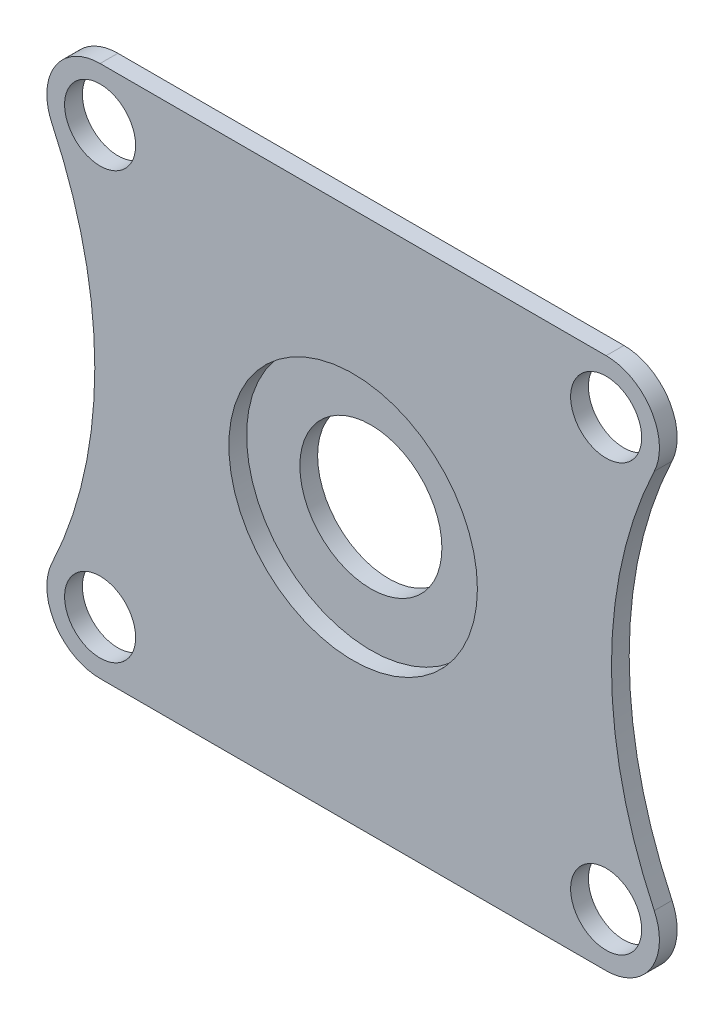
ISO-10303-21;
HEADER;
FILE_DESCRIPTION(('STEP AP214'),'2;1');
FILE_NAME('part.step','',(''),(''),'','','');
FILE_SCHEMA(('AUTOMOTIVE_DESIGN { 1 0 10303 214 1 1 1 1 }'));
ENDSEC;
DATA;
#1=APPLICATION_CONTEXT('core data for automotive mechanical design processes');
#2=APPLICATION_PROTOCOL_DEFINITION('international standard','automotive_design',2000,#1);
#3=PRODUCT_CONTEXT('',#1,'mechanical');
#4=PRODUCT('Part','Part','',(#3));
#5=PRODUCT_RELATED_PRODUCT_CATEGORY('part','',(#4));
#6=PRODUCT_DEFINITION_FORMATION('','',#4);
#7=PRODUCT_DEFINITION_CONTEXT('part definition',#1,'design');
#8=PRODUCT_DEFINITION('design','',#6,#7);
#9=PRODUCT_DEFINITION_SHAPE('','',#8);
#10=(LENGTH_UNIT() NAMED_UNIT(*) SI_UNIT(.MILLI.,.METRE.));
#11=(NAMED_UNIT(*) PLANE_ANGLE_UNIT() SI_UNIT($,.RADIAN.));
#12=(NAMED_UNIT(*) SI_UNIT($,.STERADIAN.) SOLID_ANGLE_UNIT());
#13=UNCERTAINTY_MEASURE_WITH_UNIT(LENGTH_MEASURE(1.E-05),#10,'distance_accuracy_value','');
#14=(GEOMETRIC_REPRESENTATION_CONTEXT(3) GLOBAL_UNCERTAINTY_ASSIGNED_CONTEXT((#13)) GLOBAL_UNIT_ASSIGNED_CONTEXT((#10,
#11,#12)) REPRESENTATION_CONTEXT('',''));
#15=CARTESIAN_POINT('',(0.,0.,0.));
#16=DIRECTION('',(0.,0.,1.));
#17=DIRECTION('',(1.,0.,0.));
#18=AXIS2_PLACEMENT_3D('',#15,#16,#17);
#19=CARTESIAN_POINT('',(0.,0.,9.));
#20=DIRECTION('',(0.,0.,-1.));
#21=DIRECTION('',(-1.,0.,0.));
#22=AXIS2_PLACEMENT_3D('',#19,#20,#21);
#23=CYLINDRICAL_SURFACE('',#22,4.);
#24=CARTESIAN_POINT('',(0.,0.,-1.));
#25=DIRECTION('',(0.,0.,-1.));
#26=DIRECTION('',(-1.,0.,0.));
#27=AXIS2_PLACEMENT_3D('',#24,#25,#26);
#28=CIRCLE('',#27,4.);
#29=CARTESIAN_POINT('',(-4.,0.,-0.999999999999999));
#30=VERTEX_POINT('',#29);
#31=EDGE_CURVE('E332',#30,#30,#28,.T.);
#32=ORIENTED_EDGE('',*,*,#31,.T.);
#33=EDGE_LOOP('',(#32));
#34=FACE_BOUND('',#33,.T.);
#35=CARTESIAN_POINT('',(0.,0.,0.));
#36=DIRECTION('',(0.,0.,1.));
#37=DIRECTION('',(1.,0.,0.));
#38=AXIS2_PLACEMENT_3D('',#35,#36,#37);
#39=CIRCLE('',#38,4.);
#40=CARTESIAN_POINT('',(4.,0.,0.));
#41=VERTEX_POINT('',#40);
#42=EDGE_CURVE('E42',#41,#41,#39,.F.);
#43=ORIENTED_EDGE('',*,*,#42,.F.);
#44=EDGE_LOOP('',(#43));
#45=FACE_BOUND('',#44,.T.);
#46=ADVANCED_FACE('F38',(#34,#45),#23,.F.);
#47=CARTESIAN_POINT('',(39.548221281347,0.,1.));
#48=DIRECTION('',(0.,0.,1.));
#49=DIRECTION('',(1.,0.,0.));
#50=AXIS2_PLACEMENT_3D('',#47,#48,#49);
#51=PLANE('',#50);
#52=CARTESIAN_POINT('',(0.,0.,1.));
#53=DIRECTION('',(0.,0.,1.));
#54=DIRECTION('',(1.,0.,0.));
#55=AXIS2_PLACEMENT_3D('',#52,#53,#54);
#56=CIRCLE('',#55,7.);
#57=CARTESIAN_POINT('',(7.,0.,1.));
#58=VERTEX_POINT('',#57);
#59=EDGE_CURVE('E338',#58,#58,#56,.T.);
#60=ORIENTED_EDGE('',*,*,#59,.F.);
#61=EDGE_LOOP('',(#60));
#62=FACE_BOUND('',#61,.T.);
#63=CARTESIAN_POINT('',(-14.25,-12.,1.));
#64=DIRECTION('',(0.,0.,1.));
#65=DIRECTION('',(1.,0.,0.));
#66=AXIS2_PLACEMENT_3D('',#63,#64,#65);
#67=CIRCLE('',#66,2.);
#68=CARTESIAN_POINT('',(-12.25,-12.,1.));
#69=VERTEX_POINT('',#68);
#70=EDGE_CURVE('E316',#69,#69,#67,.T.);
#71=ORIENTED_EDGE('',*,*,#70,.F.);
#72=EDGE_LOOP('',(#71));
#73=FACE_BOUND('',#72,.T.);
#74=CARTESIAN_POINT('',(14.25,12.,1.));
#75=DIRECTION('',(0.,0.,1.));
#76=DIRECTION('',(1.,0.,0.));
#77=AXIS2_PLACEMENT_3D('',#74,#75,#76);
#78=CIRCLE('',#77,2.);
#79=CARTESIAN_POINT('',(16.25,12.,1.));
#80=VERTEX_POINT('',#79);
#81=EDGE_CURVE('E148',#80,#80,#78,.T.);
#82=ORIENTED_EDGE('',*,*,#81,.F.);
#83=EDGE_LOOP('',(#82));
#84=FACE_BOUND('',#83,.T.);
#85=CARTESIAN_POINT('',(39.548221281347,0.,1.));
#86=DIRECTION('',(0.,0.,-1.));
#87=DIRECTION('',(1.,0.,0.));
#88=AXIS2_PLACEMENT_3D('',#85,#86,#87);
#89=CIRCLE('',#88,25.);
#90=CARTESIAN_POINT('',(16.9605237087158,-10.7142857142857,1.));
#91=VERTEX_POINT('',#90);
#92=CARTESIAN_POINT('',(16.9605237087158,10.7142857142857,1.));
#93=VERTEX_POINT('',#92);
#94=EDGE_CURVE('E166',#91,#93,#89,.T.);
#95=ORIENTED_EDGE('',*,*,#94,.T.);
#96=CARTESIAN_POINT('',(14.25,12.,1.));
#97=DIRECTION('',(0.,0.,1.));
#98=DIRECTION('',(1.,0.,0.));
#99=AXIS2_PLACEMENT_3D('',#96,#97,#98);
#100=CIRCLE('',#99,3.);
#101=CARTESIAN_POINT('',(14.25,15.,1.));
#102=VERTEX_POINT('',#101);
#103=EDGE_CURVE('E101',#93,#102,#100,.T.);
#104=ORIENTED_EDGE('',*,*,#103,.T.);
#105=DIRECTION('',(-1.,0.,0.));
#106=VECTOR('',#105,1.);
#107=CARTESIAN_POINT('',(-14.25,15.,1.));
#108=LINE('',#107,#106);
#109=CARTESIAN_POINT('',(-14.25,15.,1.));
#110=VERTEX_POINT('',#109);
#111=EDGE_CURVE('E291',#102,#110,#108,.T.);
#112=ORIENTED_EDGE('',*,*,#111,.T.);
#113=CARTESIAN_POINT('',(-14.25,12.,1.));
#114=DIRECTION('',(0.,0.,1.));
#115=DIRECTION('',(1.,0.,0.));
#116=AXIS2_PLACEMENT_3D('',#113,#114,#115);
#117=CIRCLE('',#116,3.);
#118=CARTESIAN_POINT('',(-16.9605237087158,10.7142857142857,1.));
#119=VERTEX_POINT('',#118);
#120=EDGE_CURVE('E294',#110,#119,#117,.T.);
#121=ORIENTED_EDGE('',*,*,#120,.T.);
#122=CARTESIAN_POINT('',(-39.548221281347,0.,1.));
#123=DIRECTION('',(0.,0.,-1.));
#124=DIRECTION('',(1.,0.,0.));
#125=AXIS2_PLACEMENT_3D('',#122,#123,#124);
#126=CIRCLE('',#125,25.);
#127=CARTESIAN_POINT('',(-16.9605237087158,-10.7142857142857,1.));
#128=VERTEX_POINT('',#127);
#129=EDGE_CURVE('E121',#119,#128,#126,.T.);
#130=ORIENTED_EDGE('',*,*,#129,.T.);
#131=CARTESIAN_POINT('',(-14.25,-12.,1.));
#132=DIRECTION('',(0.,0.,1.));
#133=DIRECTION('',(1.,0.,0.));
#134=AXIS2_PLACEMENT_3D('',#131,#132,#133);
#135=CIRCLE('',#134,3.);
#136=CARTESIAN_POINT('',(-14.25,-15.,1.));
#137=VERTEX_POINT('',#136);
#138=EDGE_CURVE('E114',#128,#137,#135,.T.);
#139=ORIENTED_EDGE('',*,*,#138,.T.);
#140=DIRECTION('',(1.,0.,0.));
#141=VECTOR('',#140,1.);
#142=CARTESIAN_POINT('',(-14.25,-15.,1.));
#143=LINE('',#142,#141);
#144=CARTESIAN_POINT('',(14.25,-15.,1.));
#145=VERTEX_POINT('',#144);
#146=EDGE_CURVE('E119',#137,#145,#143,.T.);
#147=ORIENTED_EDGE('',*,*,#146,.T.);
#148=CARTESIAN_POINT('',(14.25,-12.,1.));
#149=DIRECTION('',(0.,0.,1.));
#150=DIRECTION('',(1.,0.,0.));
#151=AXIS2_PLACEMENT_3D('',#148,#149,#150);
#152=CIRCLE('',#151,3.);
#153=EDGE_CURVE('E57',#145,#91,#152,.T.);
#154=ORIENTED_EDGE('',*,*,#153,.T.);
#155=EDGE_LOOP('',(#95,#104,#112,#121,#130,#139,#147,#154));
#156=FACE_BOUND('',#155,.T.);
#157=CARTESIAN_POINT('',(-14.25,12.,1.));
#158=DIRECTION('',(0.,0.,1.));
#159=DIRECTION('',(1.,0.,0.));
#160=AXIS2_PLACEMENT_3D('',#157,#158,#159);
#161=CIRCLE('',#160,2.);
#162=CARTESIAN_POINT('',(-12.25,12.,1.));
#163=VERTEX_POINT('',#162);
#164=EDGE_CURVE('E308',#163,#163,#161,.T.);
#165=ORIENTED_EDGE('',*,*,#164,.F.);
#166=EDGE_LOOP('',(#165));
#167=FACE_BOUND('',#166,.T.);
#168=CARTESIAN_POINT('',(14.25,-12.,1.));
#169=DIRECTION('',(0.,0.,1.));
#170=DIRECTION('',(1.,0.,0.));
#171=AXIS2_PLACEMENT_3D('',#168,#169,#170);
#172=CIRCLE('',#171,2.);
#173=CARTESIAN_POINT('',(16.25,-12.,1.));
#174=VERTEX_POINT('',#173);
#175=EDGE_CURVE('E324',#174,#174,#172,.T.);
#176=ORIENTED_EDGE('',*,*,#175,.F.);
#177=EDGE_LOOP('',(#176));
#178=FACE_BOUND('',#177,.T.);
#179=ADVANCED_FACE('F116',(#62,#73,#84,#156,#167,#178),#51,.T.);
#180=CARTESIAN_POINT('',(39.548221281347,0.,0.));
#181=DIRECTION('',(0.,0.,1.));
#182=DIRECTION('',(1.,0.,0.));
#183=AXIS2_PLACEMENT_3D('',#180,#181,#182);
#184=PLANE('',#183);
#185=CARTESIAN_POINT('',(0.,0.,0.));
#186=DIRECTION('',(0.,0.,1.));
#187=DIRECTION('',(1.,0.,0.));
#188=AXIS2_PLACEMENT_3D('',#185,#186,#187);
#189=CIRCLE('',#188,13.2310562561766);
#190=CARTESIAN_POINT('',(13.2310562561766,0.,0.));
#191=VERTEX_POINT('',#190);
#192=EDGE_CURVE('E192',#191,#191,#189,.T.);
#193=ORIENTED_EDGE('',*,*,#192,.T.);
#194=EDGE_LOOP('',(#193));
#195=FACE_BOUND('',#194,.T.);
#196=CARTESIAN_POINT('',(39.548221281347,0.,0.));
#197=DIRECTION('',(0.,0.,-1.));
#198=DIRECTION('',(1.,0.,0.));
#199=AXIS2_PLACEMENT_3D('',#196,#197,#198);
#200=CIRCLE('',#199,25.);
#201=CARTESIAN_POINT('',(16.9605237087158,-10.7142857142857,0.));
#202=VERTEX_POINT('',#201);
#203=CARTESIAN_POINT('',(16.9605237087158,10.7142857142857,0.));
#204=VERTEX_POINT('',#203);
#205=EDGE_CURVE('E143',#202,#204,#200,.T.);
#206=ORIENTED_EDGE('',*,*,#205,.F.);
#207=CARTESIAN_POINT('',(14.25,-12.,0.));
#208=DIRECTION('',(0.,0.,1.));
#209=DIRECTION('',(1.,0.,0.));
#210=AXIS2_PLACEMENT_3D('',#207,#208,#209);
#211=CIRCLE('',#210,3.);
#212=CARTESIAN_POINT('',(14.25,-15.,0.));
#213=VERTEX_POINT('',#212);
#214=EDGE_CURVE('E92',#213,#202,#211,.T.);
#215=ORIENTED_EDGE('',*,*,#214,.F.);
#216=DIRECTION('',(1.,0.,0.));
#217=VECTOR('',#216,1.);
#218=CARTESIAN_POINT('',(-14.25,-15.,0.));
#219=LINE('',#218,#217);
#220=CARTESIAN_POINT('',(-14.25,-15.,0.));
#221=VERTEX_POINT('',#220);
#222=EDGE_CURVE('E86',#221,#213,#219,.T.);
#223=ORIENTED_EDGE('',*,*,#222,.F.);
#224=CARTESIAN_POINT('',(-14.25,-12.,0.));
#225=DIRECTION('',(0.,0.,1.));
#226=DIRECTION('',(1.,0.,0.));
#227=AXIS2_PLACEMENT_3D('',#224,#225,#226);
#228=CIRCLE('',#227,3.);
#229=CARTESIAN_POINT('',(-16.9605237087158,-10.7142857142857,0.));
#230=VERTEX_POINT('',#229);
#231=EDGE_CURVE('E130',#230,#221,#228,.T.);
#232=ORIENTED_EDGE('',*,*,#231,.F.);
#233=CARTESIAN_POINT('',(-39.548221281347,0.,0.));
#234=DIRECTION('',(0.,0.,-1.));
#235=DIRECTION('',(1.,0.,0.));
#236=AXIS2_PLACEMENT_3D('',#233,#234,#235);
#237=CIRCLE('',#236,25.);
#238=CARTESIAN_POINT('',(-16.9605237087158,10.7142857142857,0.));
#239=VERTEX_POINT('',#238);
#240=EDGE_CURVE('E157',#239,#230,#237,.T.);
#241=ORIENTED_EDGE('',*,*,#240,.F.);
#242=CARTESIAN_POINT('',(-14.25,12.,0.));
#243=DIRECTION('',(0.,0.,1.));
#244=DIRECTION('',(1.,0.,0.));
#245=AXIS2_PLACEMENT_3D('',#242,#243,#244);
#246=CIRCLE('',#245,3.);
#247=CARTESIAN_POINT('',(-14.25,15.,0.));
#248=VERTEX_POINT('',#247);
#249=EDGE_CURVE('E154',#248,#239,#246,.T.);
#250=ORIENTED_EDGE('',*,*,#249,.F.);
#251=DIRECTION('',(-1.,0.,0.));
#252=VECTOR('',#251,1.);
#253=CARTESIAN_POINT('',(-14.25,15.,0.));
#254=LINE('',#253,#252);
#255=CARTESIAN_POINT('',(14.25,15.,0.));
#256=VERTEX_POINT('',#255);
#257=EDGE_CURVE('E151',#256,#248,#254,.T.);
#258=ORIENTED_EDGE('',*,*,#257,.F.);
#259=CARTESIAN_POINT('',(14.25,12.,0.));
#260=DIRECTION('',(0.,0.,1.));
#261=DIRECTION('',(1.,0.,0.));
#262=AXIS2_PLACEMENT_3D('',#259,#260,#261);
#263=CIRCLE('',#262,3.);
#264=EDGE_CURVE('E147',#204,#256,#263,.T.);
#265=ORIENTED_EDGE('',*,*,#264,.F.);
#266=EDGE_LOOP('',(#206,#215,#223,#232,#241,#250,#258,#265));
#267=FACE_BOUND('',#266,.T.);
#268=CARTESIAN_POINT('',(14.25,12.,0.));
#269=DIRECTION('',(0.,0.,1.));
#270=DIRECTION('',(1.,0.,0.));
#271=AXIS2_PLACEMENT_3D('',#268,#269,#270);
#272=CIRCLE('',#271,2.);
#273=CARTESIAN_POINT('',(16.25,12.,0.));
#274=VERTEX_POINT('',#273);
#275=EDGE_CURVE('E304',#274,#274,#272,.T.);
#276=ORIENTED_EDGE('',*,*,#275,.T.);
#277=EDGE_LOOP('',(#276));
#278=FACE_BOUND('',#277,.T.);
#279=CARTESIAN_POINT('',(-14.25,12.,0.));
#280=DIRECTION('',(0.,0.,1.));
#281=DIRECTION('',(1.,0.,0.));
#282=AXIS2_PLACEMENT_3D('',#279,#280,#281);
#283=CIRCLE('',#282,2.);
#284=CARTESIAN_POINT('',(-12.25,12.,0.));
#285=VERTEX_POINT('',#284);
#286=EDGE_CURVE('E312',#285,#285,#283,.T.);
#287=ORIENTED_EDGE('',*,*,#286,.T.);
#288=EDGE_LOOP('',(#287));
#289=FACE_BOUND('',#288,.T.);
#290=CARTESIAN_POINT('',(-14.25,-12.,0.));
#291=DIRECTION('',(0.,0.,1.));
#292=DIRECTION('',(1.,0.,0.));
#293=AXIS2_PLACEMENT_3D('',#290,#291,#292);
#294=CIRCLE('',#293,2.);
#295=CARTESIAN_POINT('',(-12.25,-12.,0.));
#296=VERTEX_POINT('',#295);
#297=EDGE_CURVE('E320',#296,#296,#294,.T.);
#298=ORIENTED_EDGE('',*,*,#297,.T.);
#299=EDGE_LOOP('',(#298));
#300=FACE_BOUND('',#299,.T.);
#301=CARTESIAN_POINT('',(14.25,-12.,0.));
#302=DIRECTION('',(0.,0.,1.));
#303=DIRECTION('',(1.,0.,0.));
#304=AXIS2_PLACEMENT_3D('',#301,#302,#303);
#305=CIRCLE('',#304,2.);
#306=CARTESIAN_POINT('',(16.25,-12.,0.));
#307=VERTEX_POINT('',#306);
#308=EDGE_CURVE('E328',#307,#307,#305,.T.);
#309=ORIENTED_EDGE('',*,*,#308,.T.);
#310=EDGE_LOOP('',(#309));
#311=FACE_BOUND('',#310,.T.);
#312=ADVANCED_FACE('F221',(#195,#267,#278,#289,#300,#311),#184,.F.);
#313=CARTESIAN_POINT('',(39.548221281347,0.,1.));
#314=DIRECTION('',(0.,0.,-1.));
#315=DIRECTION('',(-1.,0.,0.));
#316=AXIS2_PLACEMENT_3D('',#313,#314,#315);
#317=CYLINDRICAL_SURFACE('',#316,25.);
#318=ORIENTED_EDGE('',*,*,#205,.T.);
#319=DIRECTION('',(0.,0.,-1.));
#320=VECTOR('',#319,1.);
#321=CARTESIAN_POINT('',(16.9605237087158,10.7142857142857,1.));
#322=LINE('',#321,#320);
#323=EDGE_CURVE('E185',#93,#204,#322,.T.);
#324=ORIENTED_EDGE('',*,*,#323,.F.);
#325=ORIENTED_EDGE('',*,*,#94,.F.);
#326=DIRECTION('',(0.,0.,-1.));
#327=VECTOR('',#326,1.);
#328=CARTESIAN_POINT('',(16.9605237087158,-10.7142857142857,1.));
#329=LINE('',#328,#327);
#330=EDGE_CURVE('E139',#91,#202,#329,.T.);
#331=ORIENTED_EDGE('',*,*,#330,.T.);
#332=EDGE_LOOP('',(#318,#324,#325,#331));
#333=FACE_BOUND('',#332,.T.);
#334=ADVANCED_FACE('F254',(#333),#317,.F.);
#335=CARTESIAN_POINT('',(14.25,12.,1.));
#336=DIRECTION('',(0.,0.,-1.));
#337=DIRECTION('',(-1.,0.,0.));
#338=AXIS2_PLACEMENT_3D('',#335,#336,#337);
#339=CYLINDRICAL_SURFACE('',#338,3.);
#340=ORIENTED_EDGE('',*,*,#264,.T.);
#341=DIRECTION('',(0.,0.,-1.));
#342=VECTOR('',#341,1.);
#343=CARTESIAN_POINT('',(14.25,15.,1.));
#344=LINE('',#343,#342);
#345=EDGE_CURVE('E181',#102,#256,#344,.T.);
#346=ORIENTED_EDGE('',*,*,#345,.F.);
#347=ORIENTED_EDGE('',*,*,#103,.F.);
#348=ORIENTED_EDGE('',*,*,#323,.T.);
#349=EDGE_LOOP('',(#340,#346,#347,#348));
#350=FACE_BOUND('',#349,.T.);
#351=ADVANCED_FACE('F273',(#350),#339,.T.);
#352=CARTESIAN_POINT('',(-14.25,15.,1.));
#353=DIRECTION('',(0.,-1.,0.));
#354=DIRECTION('',(0.,0.,-1.));
#355=AXIS2_PLACEMENT_3D('',#352,#353,#354);
#356=PLANE('',#355);
#357=ORIENTED_EDGE('',*,*,#257,.T.);
#358=DIRECTION('',(0.,0.,-1.));
#359=VECTOR('',#358,1.);
#360=CARTESIAN_POINT('',(-14.25,15.,1.));
#361=LINE('',#360,#359);
#362=EDGE_CURVE('E177',#110,#248,#361,.T.);
#363=ORIENTED_EDGE('',*,*,#362,.F.);
#364=ORIENTED_EDGE('',*,*,#111,.F.);
#365=ORIENTED_EDGE('',*,*,#345,.T.);
#366=EDGE_LOOP('',(#357,#363,#364,#365));
#367=FACE_BOUND('',#366,.T.);
#368=ADVANCED_FACE('F269',(#367),#356,.F.);
#369=CARTESIAN_POINT('',(-14.25,12.,1.));
#370=DIRECTION('',(0.,0.,-1.));
#371=DIRECTION('',(-1.,0.,0.));
#372=AXIS2_PLACEMENT_3D('',#369,#370,#371);
#373=CYLINDRICAL_SURFACE('',#372,3.);
#374=ORIENTED_EDGE('',*,*,#249,.T.);
#375=DIRECTION('',(0.,0.,-1.));
#376=VECTOR('',#375,1.);
#377=CARTESIAN_POINT('',(-16.9605237087158,10.7142857142857,1.));
#378=LINE('',#377,#376);
#379=EDGE_CURVE('E173',#119,#239,#378,.T.);
#380=ORIENTED_EDGE('',*,*,#379,.F.);
#381=ORIENTED_EDGE('',*,*,#120,.F.);
#382=ORIENTED_EDGE('',*,*,#362,.T.);
#383=EDGE_LOOP('',(#374,#380,#381,#382));
#384=FACE_BOUND('',#383,.T.);
#385=ADVANCED_FACE('F265',(#384),#373,.T.);
#386=CARTESIAN_POINT('',(-39.548221281347,0.,1.));
#387=DIRECTION('',(0.,0.,-1.));
#388=DIRECTION('',(-1.,0.,0.));
#389=AXIS2_PLACEMENT_3D('',#386,#387,#388);
#390=CYLINDRICAL_SURFACE('',#389,25.);
#391=ORIENTED_EDGE('',*,*,#240,.T.);
#392=DIRECTION('',(0.,0.,-1.));
#393=VECTOR('',#392,1.);
#394=CARTESIAN_POINT('',(-16.9605237087158,-10.7142857142857,1.));
#395=LINE('',#394,#393);
#396=EDGE_CURVE('E132',#128,#230,#395,.T.);
#397=ORIENTED_EDGE('',*,*,#396,.F.);
#398=ORIENTED_EDGE('',*,*,#129,.F.);
#399=ORIENTED_EDGE('',*,*,#379,.T.);
#400=EDGE_LOOP('',(#391,#397,#398,#399));
#401=FACE_BOUND('',#400,.T.);
#402=ADVANCED_FACE('F262',(#401),#390,.F.);
#403=CARTESIAN_POINT('',(-14.25,-12.,1.));
#404=DIRECTION('',(0.,0.,-1.));
#405=DIRECTION('',(-1.,0.,0.));
#406=AXIS2_PLACEMENT_3D('',#403,#404,#405);
#407=CYLINDRICAL_SURFACE('',#406,3.);
#408=ORIENTED_EDGE('',*,*,#231,.T.);
#409=DIRECTION('',(0.,0.,-1.));
#410=VECTOR('',#409,1.);
#411=CARTESIAN_POINT('',(-14.25,-15.,1.));
#412=LINE('',#411,#410);
#413=EDGE_CURVE('E127',#137,#221,#412,.T.);
#414=ORIENTED_EDGE('',*,*,#413,.F.);
#415=ORIENTED_EDGE('',*,*,#138,.F.);
#416=ORIENTED_EDGE('',*,*,#396,.T.);
#417=EDGE_LOOP('',(#408,#414,#415,#416));
#418=FACE_BOUND('',#417,.T.);
#419=ADVANCED_FACE('F128',(#418),#407,.T.);
#420=CARTESIAN_POINT('',(-14.25,-15.,1.));
#421=DIRECTION('',(0.,1.,0.));
#422=DIRECTION('',(0.,0.,1.));
#423=AXIS2_PLACEMENT_3D('',#420,#421,#422);
#424=PLANE('',#423);
#425=ORIENTED_EDGE('',*,*,#222,.T.);
#426=DIRECTION('',(0.,0.,-1.));
#427=VECTOR('',#426,1.);
#428=CARTESIAN_POINT('',(14.25,-15.,1.));
#429=LINE('',#428,#427);
#430=EDGE_CURVE('E133',#145,#213,#429,.T.);
#431=ORIENTED_EDGE('',*,*,#430,.F.);
#432=ORIENTED_EDGE('',*,*,#146,.F.);
#433=ORIENTED_EDGE('',*,*,#413,.T.);
#434=EDGE_LOOP('',(#425,#431,#432,#433));
#435=FACE_BOUND('',#434,.T.);
#436=ADVANCED_FACE('F135',(#435),#424,.F.);
#437=CARTESIAN_POINT('',(14.25,-12.,1.));
#438=DIRECTION('',(0.,0.,-1.));
#439=DIRECTION('',(-1.,0.,0.));
#440=AXIS2_PLACEMENT_3D('',#437,#438,#439);
#441=CYLINDRICAL_SURFACE('',#440,3.);
#442=ORIENTED_EDGE('',*,*,#214,.T.);
#443=ORIENTED_EDGE('',*,*,#330,.F.);
#444=ORIENTED_EDGE('',*,*,#153,.F.);
#445=ORIENTED_EDGE('',*,*,#430,.T.);
#446=EDGE_LOOP('',(#442,#443,#444,#445));
#447=FACE_BOUND('',#446,.T.);
#448=ADVANCED_FACE('F249',(#447),#441,.T.);
#449=CARTESIAN_POINT('',(14.25,12.,1.));
#450=DIRECTION('',(0.,0.,-1.));
#451=DIRECTION('',(-1.,0.,0.));
#452=AXIS2_PLACEMENT_3D('',#449,#450,#451);
#453=CYLINDRICAL_SURFACE('',#452,2.);
#454=ORIENTED_EDGE('',*,*,#81,.T.);
#455=EDGE_LOOP('',(#454));
#456=FACE_BOUND('',#455,.T.);
#457=ORIENTED_EDGE('',*,*,#275,.F.);
#458=EDGE_LOOP('',(#457));
#459=FACE_BOUND('',#458,.T.);
#460=ADVANCED_FACE('F246',(#456,#459),#453,.F.);
#461=CARTESIAN_POINT('',(-14.25,12.,1.));
#462=DIRECTION('',(0.,0.,-1.));
#463=DIRECTION('',(-1.,0.,0.));
#464=AXIS2_PLACEMENT_3D('',#461,#462,#463);
#465=CYLINDRICAL_SURFACE('',#464,2.);
#466=ORIENTED_EDGE('',*,*,#164,.T.);
#467=EDGE_LOOP('',(#466));
#468=FACE_BOUND('',#467,.T.);
#469=ORIENTED_EDGE('',*,*,#286,.F.);
#470=EDGE_LOOP('',(#469));
#471=FACE_BOUND('',#470,.T.);
#472=ADVANCED_FACE('F242',(#468,#471),#465,.F.);
#473=CARTESIAN_POINT('',(-14.25,-12.,1.));
#474=DIRECTION('',(0.,0.,-1.));
#475=DIRECTION('',(-1.,0.,0.));
#476=AXIS2_PLACEMENT_3D('',#473,#474,#475);
#477=CYLINDRICAL_SURFACE('',#476,2.);
#478=ORIENTED_EDGE('',*,*,#70,.T.);
#479=EDGE_LOOP('',(#478));
#480=FACE_BOUND('',#479,.T.);
#481=ORIENTED_EDGE('',*,*,#297,.F.);
#482=EDGE_LOOP('',(#481));
#483=FACE_BOUND('',#482,.T.);
#484=ADVANCED_FACE('F238',(#480,#483),#477,.F.);
#485=CARTESIAN_POINT('',(14.25,-12.,1.));
#486=DIRECTION('',(0.,0.,-1.));
#487=DIRECTION('',(-1.,0.,0.));
#488=AXIS2_PLACEMENT_3D('',#485,#486,#487);
#489=CYLINDRICAL_SURFACE('',#488,2.);
#490=ORIENTED_EDGE('',*,*,#175,.T.);
#491=EDGE_LOOP('',(#490));
#492=FACE_BOUND('',#491,.T.);
#493=ORIENTED_EDGE('',*,*,#308,.F.);
#494=EDGE_LOOP('',(#493));
#495=FACE_BOUND('',#494,.T.);
#496=ADVANCED_FACE('F234',(#492,#495),#489,.F.);
#497=CARTESIAN_POINT('',(0.,0.,0.));
#498=DIRECTION('',(0.,0.,1.));
#499=DIRECTION('',(1.,0.,0.));
#500=AXIS2_PLACEMENT_3D('',#497,#498,#499);
#501=CONICAL_SURFACE('',#500,12.,1.32581766366803);
#502=CARTESIAN_POINT('',(0.,0.,-0.701425001453319));
#503=DIRECTION('',(0.,0.,-1.));
#504=DIRECTION('',(-1.,0.,0.));
#505=AXIS2_PLACEMENT_3D('',#502,#503,#504);
#506=CIRCLE('',#505,9.19429999418672);
#507=CARTESIAN_POINT('',(-9.19429999418672,0.,-0.701425001453318));
#508=VERTEX_POINT('',#507);
#509=EDGE_CURVE('E11',#508,#508,#506,.F.);
#510=ORIENTED_EDGE('',*,*,#509,.T.);
#511=EDGE_LOOP('',(#510));
#512=FACE_BOUND('',#511,.T.);
#513=CARTESIAN_POINT('',(0.,0.,-0.298574998546686));
#514=DIRECTION('',(0.,0.,1.));
#515=DIRECTION('',(1.,0.,0.));
#516=AXIS2_PLACEMENT_3D('',#513,#514,#515);
#517=CIRCLE('',#516,10.8057000058133);
#518=CARTESIAN_POINT('',(10.8057000058133,0.,-0.298574998546687));
#519=VERTEX_POINT('',#518);
#520=EDGE_CURVE('E188',#519,#519,#517,.F.);
#521=ORIENTED_EDGE('',*,*,#520,.T.);
#522=EDGE_LOOP('',(#521));
#523=FACE_BOUND('',#522,.T.);
#524=ADVANCED_FACE('F230',(#512,#523),#501,.T.);
#525=CARTESIAN_POINT('',(0.,0.,-1.));
#526=DIRECTION('',(0.,0.,1.));
#527=DIRECTION('',(1.,0.,0.));
#528=AXIS2_PLACEMENT_3D('',#525,#526,#527);
#529=PLANE('',#528);
#530=ORIENTED_EDGE('',*,*,#31,.F.);
#531=EDGE_LOOP('',(#530));
#532=FACE_BOUND('',#531,.T.);
#533=CARTESIAN_POINT('',(0.,0.,-0.999999999999999));
#534=DIRECTION('',(0.,0.,1.));
#535=DIRECTION('',(1.,0.,0.));
#536=AXIS2_PLACEMENT_3D('',#533,#534,#535);
#537=CIRCLE('',#536,6.76894374382339);
#538=CARTESIAN_POINT('',(6.76894374382339,0.,-1.));
#539=VERTEX_POINT('',#538);
#540=EDGE_CURVE('E49',#539,#539,#537,.F.);
#541=ORIENTED_EDGE('',*,*,#540,.T.);
#542=EDGE_LOOP('',(#541));
#543=FACE_BOUND('',#542,.T.);
#544=ADVANCED_FACE('F200',(#532,#543),#529,.F.);
#545=CARTESIAN_POINT('',(0.,0.,-10.));
#546=DIRECTION('',(0.,0.,1.));
#547=DIRECTION('',(1.,0.,0.));
#548=AXIS2_PLACEMENT_3D('',#545,#546,#547);
#549=TOROIDAL_SURFACE('',#548,13.2310562561766,10.);
#550=ORIENTED_EDGE('',*,*,#192,.F.);
#551=EDGE_LOOP('',(#550));
#552=FACE_BOUND('',#551,.T.);
#553=ORIENTED_EDGE('',*,*,#520,.F.);
#554=EDGE_LOOP('',(#553));
#555=FACE_BOUND('',#554,.T.);
#556=ADVANCED_FACE('F204',(#552,#555),#549,.F.);
#557=CARTESIAN_POINT('',(0.,0.,9.));
#558=DIRECTION('',(0.,0.,1.));
#559=DIRECTION('',(1.,0.,0.));
#560=AXIS2_PLACEMENT_3D('',#557,#558,#559);
#561=DEGENERATE_TOROIDAL_SURFACE('',#560,6.76894374382339,10.,.T.);
#562=ORIENTED_EDGE('',*,*,#509,.F.);
#563=EDGE_LOOP('',(#562));
#564=FACE_BOUND('',#563,.T.);
#565=ORIENTED_EDGE('',*,*,#540,.F.);
#566=EDGE_LOOP('',(#565));
#567=FACE_BOUND('',#566,.T.);
#568=ADVANCED_FACE('F40',(#564,#567),#561,.T.);
#569=CARTESIAN_POINT('',(0.,0.,0.));
#570=DIRECTION('',(0.,0.,1.));
#571=DIRECTION('',(1.,0.,0.));
#572=AXIS2_PLACEMENT_3D('',#569,#570,#571);
#573=PLANE('',#572);
#574=CARTESIAN_POINT('',(0.,0.,0.));
#575=DIRECTION('',(0.,0.,1.));
#576=DIRECTION('',(1.,0.,0.));
#577=AXIS2_PLACEMENT_3D('',#574,#575,#576);
#578=CIRCLE('',#577,7.);
#579=CARTESIAN_POINT('',(7.,0.,0.));
#580=VERTEX_POINT('',#579);
#581=EDGE_CURVE('E342',#580,#580,#578,.T.);
#582=ORIENTED_EDGE('',*,*,#581,.T.);
#583=EDGE_LOOP('',(#582));
#584=FACE_BOUND('',#583,.T.);
#585=ORIENTED_EDGE('',*,*,#42,.T.);
#586=EDGE_LOOP('',(#585));
#587=FACE_BOUND('',#586,.T.);
#588=ADVANCED_FACE('F203',(#584,#587),#573,.T.);
#589=CARTESIAN_POINT('',(0.,0.,0.));
#590=DIRECTION('',(0.,0.,1.));
#591=DIRECTION('',(1.,0.,0.));
#592=AXIS2_PLACEMENT_3D('',#589,#590,#591);
#593=CYLINDRICAL_SURFACE('',#592,7.);
#594=ORIENTED_EDGE('',*,*,#581,.F.);
#595=EDGE_LOOP('',(#594));
#596=FACE_BOUND('',#595,.T.);
#597=ORIENTED_EDGE('',*,*,#59,.T.);
#598=EDGE_LOOP('',(#597));
#599=FACE_BOUND('',#598,.T.);
#600=ADVANCED_FACE('F211',(#596,#599),#593,.F.);
#601=CLOSED_SHELL('',(#46,#179,#312,#334,#351,#368,#385,#402,#419,#436,#448,#460,#472,#484,#496,
#524,#544,#556,#568,#588,#600));
#602=MANIFOLD_SOLID_BREP('B2',#601);
#603=ADVANCED_BREP_SHAPE_REPRESENTATION('',(#18,#602),#14);
#604=SHAPE_DEFINITION_REPRESENTATION(#9,#603);
ENDSEC;
END-ISO-10303-21;
